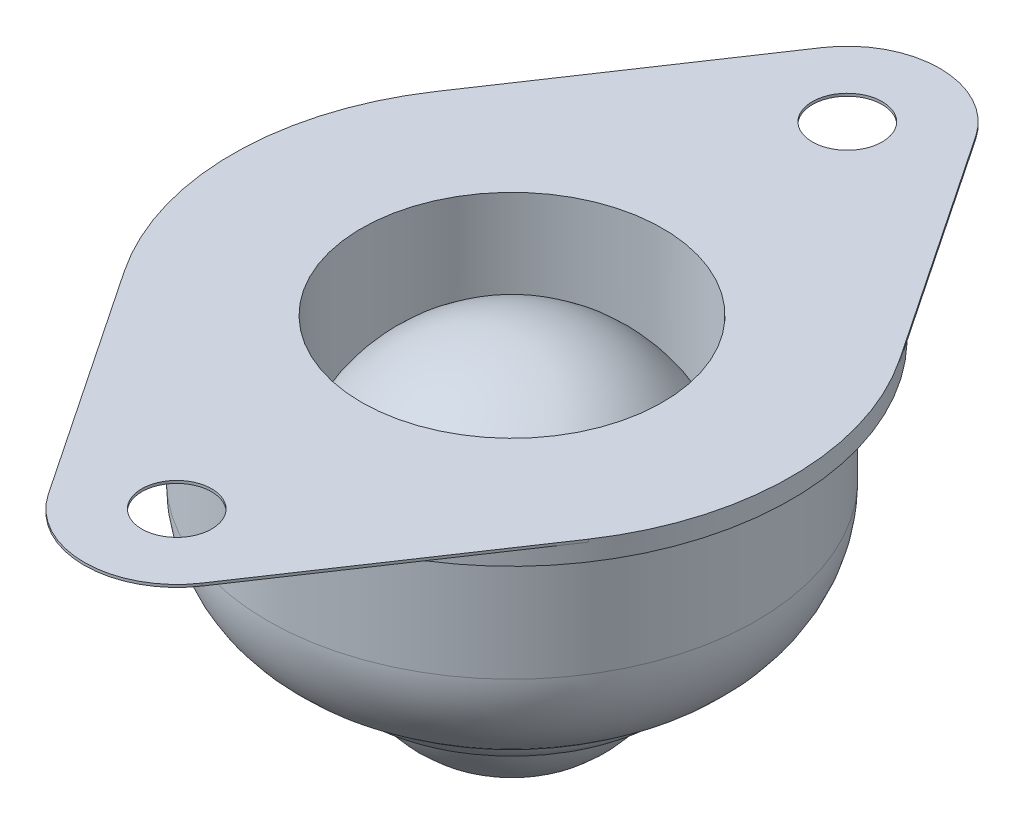
ISO-10303-21;
HEADER;
FILE_DESCRIPTION(('STEP AP214'),'2;1');
FILE_NAME('part.step','',(''),(''),'','','');
FILE_SCHEMA(('AUTOMOTIVE_DESIGN { 1 0 10303 214 1 1 1 1 }'));
ENDSEC;
DATA;
#1=APPLICATION_CONTEXT('core data for automotive mechanical design processes');
#2=APPLICATION_PROTOCOL_DEFINITION('international standard','automotive_design',2000,#1);
#3=PRODUCT_CONTEXT('',#1,'mechanical');
#4=PRODUCT('Part','Part','',(#3));
#5=PRODUCT_RELATED_PRODUCT_CATEGORY('part','',(#4));
#6=PRODUCT_DEFINITION_FORMATION('','',#4);
#7=PRODUCT_DEFINITION_CONTEXT('part definition',#1,'design');
#8=PRODUCT_DEFINITION('design','',#6,#7);
#9=PRODUCT_DEFINITION_SHAPE('','',#8);
#10=(LENGTH_UNIT() NAMED_UNIT(*) SI_UNIT(.MILLI.,.METRE.));
#11=(NAMED_UNIT(*) PLANE_ANGLE_UNIT() SI_UNIT($,.RADIAN.));
#12=(NAMED_UNIT(*) SI_UNIT($,.STERADIAN.) SOLID_ANGLE_UNIT());
#13=UNCERTAINTY_MEASURE_WITH_UNIT(LENGTH_MEASURE(1.E-05),#10,'distance_accuracy_value','');
#14=(GEOMETRIC_REPRESENTATION_CONTEXT(3) GLOBAL_UNCERTAINTY_ASSIGNED_CONTEXT((#13)) GLOBAL_UNIT_ASSIGNED_CONTEXT((#10,
#11,#12)) REPRESENTATION_CONTEXT('',''));
#15=CARTESIAN_POINT('',(0.,0.,0.));
#16=DIRECTION('',(0.,0.,1.));
#17=DIRECTION('',(1.,0.,0.));
#18=AXIS2_PLACEMENT_3D('',#15,#16,#17);
#19=CARTESIAN_POINT('',(0.,7.5,0.));
#20=DIRECTION('',(0.,1.,0.));
#21=DIRECTION('',(1.,0.,0.));
#22=AXIS2_PLACEMENT_3D('',#19,#20,#21);
#23=SPHERICAL_SURFACE('',#22,7.5);
#24=CARTESIAN_POINT('',(0.,5.07300335395181,0.));
#25=DIRECTION('',(0.,1.,0.));
#26=DIRECTION('',(0.,0.,1.));
#27=AXIS2_PLACEMENT_3D('',#24,#25,#26);
#28=CIRCLE('',#27,7.0964559661898);
#29=CARTESIAN_POINT('',(0.,5.07300335395181,7.0964559661898));
#30=VERTEX_POINT('',#29);
#31=EDGE_CURVE('E110',#30,#30,#28,.T.);
#32=ORIENTED_EDGE('',*,*,#31,.F.);
#33=EDGE_LOOP('',(#32));
#34=FACE_BOUND('',#33,.T.);
#35=ADVANCED_FACE('F34',(#34),#23,.T.);
#36=CARTESIAN_POINT('',(0.,20.2219191915097,0.));
#37=DIRECTION('',(0.,1.,0.));
#38=DIRECTION('',(0.,0.,1.));
#39=AXIS2_PLACEMENT_3D('',#36,#37,#38);
#40=CYLINDRICAL_SURFACE('',#39,16.);
#41=CARTESIAN_POINT('',(0.,21.11,0.));
#42=DIRECTION('',(0.,1.,0.));
#43=DIRECTION('',(0.,0.,1.));
#44=AXIS2_PLACEMENT_3D('',#41,#42,#43);
#45=CIRCLE('',#44,16.);
#46=CARTESIAN_POINT('',(13.2850688954012,21.11,-8.91666666666665));
#47=VERTEX_POINT('',#46);
#48=CARTESIAN_POINT('',(-13.2850688954012,21.11,-8.91666666666667));
#49=VERTEX_POINT('',#48);
#50=EDGE_CURVE('E41',#47,#49,#45,.T.);
#51=ORIENTED_EDGE('',*,*,#50,.F.);
#52=DIRECTION('',(0.,-1.,0.));
#53=VECTOR('',#52,1.);
#54=CARTESIAN_POINT('',(13.2850688954012,21.26,-8.91666666666666));
#55=LINE('',#54,#53);
#56=CARTESIAN_POINT('',(13.2850688954012,21.26,-8.91666666666666));
#57=VERTEX_POINT('',#56);
#58=EDGE_CURVE('E175',#57,#47,#55,.T.);
#59=ORIENTED_EDGE('',*,*,#58,.F.);
#60=CARTESIAN_POINT('',(0.,21.26,0.));
#61=DIRECTION('',(0.,1.,0.));
#62=DIRECTION('',(0.,0.,1.));
#63=AXIS2_PLACEMENT_3D('',#60,#61,#62);
#64=CIRCLE('',#63,16.);
#65=CARTESIAN_POINT('',(13.2850688954012,21.26,8.91666666666666));
#66=VERTEX_POINT('',#65);
#67=EDGE_CURVE('E118',#66,#57,#64,.T.);
#68=ORIENTED_EDGE('',*,*,#67,.F.);
#69=DIRECTION('',(0.,-1.,0.));
#70=VECTOR('',#69,1.);
#71=CARTESIAN_POINT('',(13.2850688954012,21.26,8.91666666666666));
#72=LINE('',#71,#70);
#73=CARTESIAN_POINT('',(13.2850688954012,21.11,8.91666666666666));
#74=VERTEX_POINT('',#73);
#75=EDGE_CURVE('E111',#66,#74,#72,.T.);
#76=ORIENTED_EDGE('',*,*,#75,.T.);
#77=CARTESIAN_POINT('',(-13.2850688954012,21.11,8.91666666666667));
#78=VERTEX_POINT('',#77);
#79=EDGE_CURVE('E48',#78,#74,#45,.T.);
#80=ORIENTED_EDGE('',*,*,#79,.F.);
#81=DIRECTION('',(0.,-1.,0.));
#82=VECTOR('',#81,1.);
#83=CARTESIAN_POINT('',(-13.2850688954012,21.26,8.91666666666667));
#84=LINE('',#83,#82);
#85=CARTESIAN_POINT('',(-13.2850688954012,21.26,8.91666666666667));
#86=VERTEX_POINT('',#85);
#87=EDGE_CURVE('E165',#86,#78,#84,.T.);
#88=ORIENTED_EDGE('',*,*,#87,.F.);
#89=CARTESIAN_POINT('',(-13.2850688954012,21.26,-8.91666666666667));
#90=VERTEX_POINT('',#89);
#91=EDGE_CURVE('E132',#90,#86,#64,.T.);
#92=ORIENTED_EDGE('',*,*,#91,.F.);
#93=DIRECTION('',(0.,-1.,0.));
#94=VECTOR('',#93,1.);
#95=CARTESIAN_POINT('',(-13.2850688954012,21.26,-8.91666666666667));
#96=LINE('',#95,#94);
#97=EDGE_CURVE('E167',#90,#49,#96,.T.);
#98=ORIENTED_EDGE('',*,*,#97,.T.);
#99=EDGE_LOOP('',(#51,#59,#68,#76,#80,#88,#92,#98));
#100=FACE_BOUND('',#99,.T.);
#101=CARTESIAN_POINT('',(0.,20.1236584445246,0.));
#102=DIRECTION('',(0.,1.,0.));
#103=DIRECTION('',(0.,0.,1.));
#104=AXIS2_PLACEMENT_3D('',#101,#102,#103);
#105=CIRCLE('',#104,16.);
#106=CARTESIAN_POINT('',(0.,20.1236584445246,16.));
#107=VERTEX_POINT('',#106);
#108=EDGE_CURVE('E190',#107,#107,#105,.T.);
#109=ORIENTED_EDGE('',*,*,#108,.T.);
#110=EDGE_LOOP('',(#109));
#111=FACE_BOUND('',#110,.T.);
#112=ADVANCED_FACE('F195',(#100,#111),#40,.T.);
#113=CARTESIAN_POINT('',(0.,18.139051508652,0.));
#114=DIRECTION('',(0.,1.,0.));
#115=DIRECTION('',(0.,0.,1.));
#116=AXIS2_PLACEMENT_3D('',#113,#114,#115);
#117=TOROIDAL_SURFACE('',#116,15.7489809292657,2.00041877210397);
#118=ORIENTED_EDGE('',*,*,#108,.F.);
#119=EDGE_LOOP('',(#118));
#120=FACE_BOUND('',#119,.T.);
#121=CARTESIAN_POINT('',(0.,19.11,0.));
#122=DIRECTION('',(0.,1.,0.));
#123=DIRECTION('',(0.,0.,1.));
#124=AXIS2_PLACEMENT_3D('',#121,#122,#123);
#125=CIRCLE('',#124,14.);
#126=CARTESIAN_POINT('',(0.,19.11,14.));
#127=VERTEX_POINT('',#126);
#128=EDGE_CURVE('E187',#127,#127,#125,.T.);
#129=ORIENTED_EDGE('',*,*,#128,.T.);
#130=EDGE_LOOP('',(#129));
#131=FACE_BOUND('',#130,.T.);
#132=ADVANCED_FACE('F232',(#120,#131),#117,.F.);
#133=CARTESIAN_POINT('',(0.,20.2219191915097,0.));
#134=DIRECTION('',(0.,1.,0.));
#135=DIRECTION('',(0.,0.,1.));
#136=AXIS2_PLACEMENT_3D('',#133,#134,#135);
#137=CYLINDRICAL_SURFACE('',#136,14.);
#138=ORIENTED_EDGE('',*,*,#128,.F.);
#139=EDGE_LOOP('',(#138));
#140=FACE_BOUND('',#139,.T.);
#141=CARTESIAN_POINT('',(0.,13.11,0.));
#142=DIRECTION('',(0.,1.,0.));
#143=DIRECTION('',(0.,0.,1.));
#144=AXIS2_PLACEMENT_3D('',#141,#142,#143);
#145=CIRCLE('',#144,14.);
#146=CARTESIAN_POINT('',(0.,13.11,14.));
#147=VERTEX_POINT('',#146);
#148=EDGE_CURVE('E184',#147,#147,#145,.T.);
#149=ORIENTED_EDGE('',*,*,#148,.T.);
#150=EDGE_LOOP('',(#149));
#151=FACE_BOUND('',#150,.T.);
#152=ADVANCED_FACE('F248',(#140,#151),#137,.T.);
#153=CARTESIAN_POINT('',(0.,13.11,0.));
#154=DIRECTION('',(0.,1.,0.));
#155=DIRECTION('',(0.,0.,1.));
#156=AXIS2_PLACEMENT_3D('',#153,#154,#155);
#157=TOROIDAL_SURFACE('',#156,7.25011691103347,6.74988308896653);
#158=ORIENTED_EDGE('',*,*,#148,.F.);
#159=EDGE_LOOP('',(#158));
#160=FACE_BOUND('',#159,.T.);
#161=CARTESIAN_POINT('',(0.,6.74561764648976,0.));
#162=DIRECTION('',(0.,1.,0.));
#163=DIRECTION('',(0.,0.,1.));
#164=AXIS2_PLACEMENT_3D('',#161,#162,#163);
#165=CIRCLE('',#164,9.49857393153526);
#166=CARTESIAN_POINT('',(0.,6.74561764648976,9.49857393153526));
#167=VERTEX_POINT('',#166);
#168=EDGE_CURVE('E181',#167,#167,#165,.T.);
#169=ORIENTED_EDGE('',*,*,#168,.T.);
#170=EDGE_LOOP('',(#169));
#171=FACE_BOUND('',#170,.T.);
#172=ADVANCED_FACE('F239',(#160,#171),#157,.T.);
#173=CARTESIAN_POINT('',(0.,7.33975394743478,0.));
#174=DIRECTION('',(0.,1.,0.));
#175=DIRECTION('',(0.,0.,1.));
#176=AXIS2_PLACEMENT_3D('',#173,#174,#175);
#177=TOROIDAL_SURFACE('',#176,7.30148553274129,2.27600425663392);
#178=ORIENTED_EDGE('',*,*,#168,.F.);
#179=EDGE_LOOP('',(#178));
#180=FACE_BOUND('',#179,.T.);
#181=ORIENTED_EDGE('',*,*,#31,.T.);
#182=EDGE_LOOP('',(#181));
#183=FACE_BOUND('',#182,.T.);
#184=ADVANCED_FACE('F236',(#180,#183),#177,.T.);
#185=CARTESIAN_POINT('',(0.,21.11,0.));
#186=DIRECTION('',(0.,1.,0.));
#187=DIRECTION('',(0.,0.,1.));
#188=AXIS2_PLACEMENT_3D('',#185,#186,#187);
#189=PLANE('',#188);
#190=CARTESIAN_POINT('',(0.,21.11,-19.2));
#191=DIRECTION('',(0.,1.,0.));
#192=DIRECTION('',(0.,0.,1.));
#193=AXIS2_PLACEMENT_3D('',#190,#191,#192);
#194=CIRCLE('',#193,2.);
#195=CARTESIAN_POINT('',(0.,21.11,-17.2));
#196=VERTEX_POINT('',#195);
#197=EDGE_CURVE('E124',#196,#196,#194,.T.);
#198=ORIENTED_EDGE('',*,*,#197,.T.);
#199=EDGE_LOOP('',(#198));
#200=FACE_BOUND('',#199,.T.);
#201=DIRECTION('',(0.557291666666666,0.,0.830316805962573));
#202=VECTOR('',#201,1.);
#203=CARTESIAN_POINT('',(13.2850688954012,21.11,-8.91666666666665));
#204=LINE('',#203,#202);
#205=CARTESIAN_POINT('',(4.40067907160164,21.11,-22.1536458333333));
#206=VERTEX_POINT('',#205);
#207=EDGE_CURVE('E153',#206,#47,#204,.T.);
#208=ORIENTED_EDGE('',*,*,#207,.T.);
#209=ORIENTED_EDGE('',*,*,#50,.T.);
#210=DIRECTION('',(-0.557291666666667,0.,0.830316805962573));
#211=VECTOR('',#210,1.);
#212=CARTESIAN_POINT('',(-13.2850688954012,21.11,-8.91666666666667));
#213=LINE('',#212,#211);
#214=CARTESIAN_POINT('',(-4.40067907160164,21.11,-22.1536458333333));
#215=VERTEX_POINT('',#214);
#216=EDGE_CURVE('E157',#215,#49,#213,.T.);
#217=ORIENTED_EDGE('',*,*,#216,.F.);
#218=CARTESIAN_POINT('',(0.,21.11,-19.2));
#219=DIRECTION('',(0.,1.,0.));
#220=DIRECTION('',(0.,0.,1.));
#221=AXIS2_PLACEMENT_3D('',#218,#219,#220);
#222=CIRCLE('',#221,5.3);
#223=EDGE_CURVE('E155',#206,#215,#222,.T.);
#224=ORIENTED_EDGE('',*,*,#223,.F.);
#225=EDGE_LOOP('',(#208,#209,#217,#224));
#226=FACE_BOUND('',#225,.T.);
#227=ADVANCED_FACE('F238',(#200,#226),#189,.F.);
#228=CARTESIAN_POINT('',(0.,21.11,19.2));
#229=DIRECTION('',(0.,1.,0.));
#230=DIRECTION('',(0.,0.,1.));
#231=AXIS2_PLACEMENT_3D('',#228,#229,#230);
#232=CIRCLE('',#231,2.);
#233=CARTESIAN_POINT('',(0.,21.11,21.2));
#234=VERTEX_POINT('',#233);
#235=EDGE_CURVE('E127',#234,#234,#232,.F.);
#236=ORIENTED_EDGE('',*,*,#235,.F.);
#237=EDGE_LOOP('',(#236));
#238=FACE_BOUND('',#237,.T.);
#239=DIRECTION('',(-0.557291666666667,0.,-0.830316805962573));
#240=VECTOR('',#239,1.);
#241=CARTESIAN_POINT('',(-13.2850688954012,21.11,8.91666666666666));
#242=LINE('',#241,#240);
#243=CARTESIAN_POINT('',(-4.40067907160164,21.11,22.1536458333333));
#244=VERTEX_POINT('',#243);
#245=EDGE_CURVE('E159',#244,#78,#242,.T.);
#246=ORIENTED_EDGE('',*,*,#245,.T.);
#247=ORIENTED_EDGE('',*,*,#79,.T.);
#248=DIRECTION('',(0.557291666666666,0.,-0.830316805962573));
#249=VECTOR('',#248,1.);
#250=CARTESIAN_POINT('',(13.2850688954012,21.11,8.91666666666665));
#251=LINE('',#250,#249);
#252=CARTESIAN_POINT('',(4.40067907160164,21.11,22.1536458333333));
#253=VERTEX_POINT('',#252);
#254=EDGE_CURVE('E151',#253,#74,#251,.T.);
#255=ORIENTED_EDGE('',*,*,#254,.F.);
#256=CARTESIAN_POINT('',(0.,21.11,19.2));
#257=DIRECTION('',(0.,1.,0.));
#258=DIRECTION('',(0.,0.,1.));
#259=AXIS2_PLACEMENT_3D('',#256,#257,#258);
#260=CIRCLE('',#259,5.3);
#261=EDGE_CURVE('E106',#253,#244,#260,.F.);
#262=ORIENTED_EDGE('',*,*,#261,.T.);
#263=EDGE_LOOP('',(#246,#247,#255,#262));
#264=FACE_BOUND('',#263,.T.);
#265=ADVANCED_FACE('F193',(#238,#264),#189,.F.);
#266=CARTESIAN_POINT('',(0.,21.26,19.2));
#267=DIRECTION('',(0.,-1.,0.));
#268=DIRECTION('',(0.,0.,-1.));
#269=AXIS2_PLACEMENT_3D('',#266,#267,#268);
#270=CYLINDRICAL_SURFACE('',#269,5.3);
#271=ORIENTED_EDGE('',*,*,#261,.F.);
#272=DIRECTION('',(0.,-1.,0.));
#273=VECTOR('',#272,1.);
#274=CARTESIAN_POINT('',(4.40067907160164,21.26,22.1536458333333));
#275=LINE('',#274,#273);
#276=CARTESIAN_POINT('',(4.40067907160164,21.26,22.1536458333333));
#277=VERTEX_POINT('',#276);
#278=EDGE_CURVE('E99',#277,#253,#275,.T.);
#279=ORIENTED_EDGE('',*,*,#278,.F.);
#280=CARTESIAN_POINT('',(0.,21.26,19.2));
#281=DIRECTION('',(0.,1.,0.));
#282=DIRECTION('',(0.,0.,1.));
#283=AXIS2_PLACEMENT_3D('',#280,#281,#282);
#284=CIRCLE('',#283,5.3);
#285=CARTESIAN_POINT('',(-4.40067907160164,21.26,22.1536458333333));
#286=VERTEX_POINT('',#285);
#287=EDGE_CURVE('E103',#277,#286,#284,.F.);
#288=ORIENTED_EDGE('',*,*,#287,.T.);
#289=DIRECTION('',(0.,-1.,0.));
#290=VECTOR('',#289,1.);
#291=CARTESIAN_POINT('',(-4.40067907160164,21.26,22.1536458333333));
#292=LINE('',#291,#290);
#293=EDGE_CURVE('E149',#286,#244,#292,.T.);
#294=ORIENTED_EDGE('',*,*,#293,.T.);
#295=EDGE_LOOP('',(#271,#279,#288,#294));
#296=FACE_BOUND('',#295,.T.);
#297=ADVANCED_FACE('F101',(#296),#270,.T.);
#298=CARTESIAN_POINT('',(13.2850688954012,21.26,8.91666666666665));
#299=DIRECTION('',(-0.830316805962573,0.,-0.557291666666666));
#300=DIRECTION('',(-0.557291666666666,0.,0.830316805962573));
#301=AXIS2_PLACEMENT_3D('',#298,#299,#300);
#302=PLANE('',#301);
#303=ORIENTED_EDGE('',*,*,#254,.T.);
#304=ORIENTED_EDGE('',*,*,#75,.F.);
#305=DIRECTION('',(0.557291666666666,0.,-0.830316805962573));
#306=VECTOR('',#305,1.);
#307=CARTESIAN_POINT('',(13.2850688954012,21.26,8.91666666666665));
#308=LINE('',#307,#306);
#309=EDGE_CURVE('E114',#277,#66,#308,.T.);
#310=ORIENTED_EDGE('',*,*,#309,.F.);
#311=ORIENTED_EDGE('',*,*,#278,.T.);
#312=EDGE_LOOP('',(#303,#304,#310,#311));
#313=FACE_BOUND('',#312,.T.);
#314=ADVANCED_FACE('F115',(#313),#302,.F.);
#315=CARTESIAN_POINT('',(13.2850688954012,21.26,-8.91666666666665));
#316=DIRECTION('',(0.830316805962573,0.,-0.557291666666666));
#317=DIRECTION('',(-0.557291666666666,0.,-0.830316805962573));
#318=AXIS2_PLACEMENT_3D('',#315,#316,#317);
#319=PLANE('',#318);
#320=ORIENTED_EDGE('',*,*,#207,.F.);
#321=DIRECTION('',(0.,-1.,0.));
#322=VECTOR('',#321,1.);
#323=CARTESIAN_POINT('',(4.40067907160164,21.26,-22.1536458333333));
#324=LINE('',#323,#322);
#325=CARTESIAN_POINT('',(4.40067907160164,21.26,-22.1536458333333));
#326=VERTEX_POINT('',#325);
#327=EDGE_CURVE('E173',#326,#206,#324,.T.);
#328=ORIENTED_EDGE('',*,*,#327,.F.);
#329=DIRECTION('',(0.557291666666666,0.,0.830316805962573));
#330=VECTOR('',#329,1.);
#331=CARTESIAN_POINT('',(13.2850688954012,21.26,-8.91666666666665));
#332=LINE('',#331,#330);
#333=EDGE_CURVE('E131',#326,#57,#332,.T.);
#334=ORIENTED_EDGE('',*,*,#333,.T.);
#335=ORIENTED_EDGE('',*,*,#58,.T.);
#336=EDGE_LOOP('',(#320,#328,#334,#335));
#337=FACE_BOUND('',#336,.T.);
#338=ADVANCED_FACE('F203',(#337),#319,.T.);
#339=CARTESIAN_POINT('',(0.,21.26,-19.2));
#340=DIRECTION('',(0.,-1.,0.));
#341=DIRECTION('',(0.,0.,-1.));
#342=AXIS2_PLACEMENT_3D('',#339,#340,#341);
#343=CYLINDRICAL_SURFACE('',#342,5.3);
#344=ORIENTED_EDGE('',*,*,#223,.T.);
#345=DIRECTION('',(0.,-1.,0.));
#346=VECTOR('',#345,1.);
#347=CARTESIAN_POINT('',(-4.40067907160164,21.26,-22.1536458333333));
#348=LINE('',#347,#346);
#349=CARTESIAN_POINT('',(-4.40067907160164,21.26,-22.1536458333333));
#350=VERTEX_POINT('',#349);
#351=EDGE_CURVE('E170',#350,#215,#348,.T.);
#352=ORIENTED_EDGE('',*,*,#351,.F.);
#353=CARTESIAN_POINT('',(0.,21.26,-19.2));
#354=DIRECTION('',(0.,1.,0.));
#355=DIRECTION('',(0.,0.,1.));
#356=AXIS2_PLACEMENT_3D('',#353,#354,#355);
#357=CIRCLE('',#356,5.3);
#358=EDGE_CURVE('E135',#326,#350,#357,.T.);
#359=ORIENTED_EDGE('',*,*,#358,.F.);
#360=ORIENTED_EDGE('',*,*,#327,.T.);
#361=EDGE_LOOP('',(#344,#352,#359,#360));
#362=FACE_BOUND('',#361,.T.);
#363=ADVANCED_FACE('F206',(#362),#343,.T.);
#364=CARTESIAN_POINT('',(-13.2850688954012,21.26,-8.91666666666667));
#365=DIRECTION('',(0.830316805962573,0.,0.557291666666667));
#366=DIRECTION('',(0.557291666666667,0.,-0.830316805962573));
#367=AXIS2_PLACEMENT_3D('',#364,#365,#366);
#368=PLANE('',#367);
#369=ORIENTED_EDGE('',*,*,#216,.T.);
#370=ORIENTED_EDGE('',*,*,#97,.F.);
#371=DIRECTION('',(-0.557291666666667,0.,0.830316805962573));
#372=VECTOR('',#371,1.);
#373=CARTESIAN_POINT('',(-13.2850688954012,21.26,-8.91666666666667));
#374=LINE('',#373,#372);
#375=EDGE_CURVE('E137',#350,#90,#374,.T.);
#376=ORIENTED_EDGE('',*,*,#375,.F.);
#377=ORIENTED_EDGE('',*,*,#351,.T.);
#378=EDGE_LOOP('',(#369,#370,#376,#377));
#379=FACE_BOUND('',#378,.T.);
#380=ADVANCED_FACE('F210',(#379),#368,.F.);
#381=CARTESIAN_POINT('',(0.,21.26,19.2));
#382=DIRECTION('',(0.,-1.,0.));
#383=DIRECTION('',(0.,0.,-1.));
#384=AXIS2_PLACEMENT_3D('',#381,#382,#383);
#385=CYLINDRICAL_SURFACE('',#384,2.);
#386=CARTESIAN_POINT('',(0.,21.26,19.2));
#387=DIRECTION('',(0.,1.,0.));
#388=DIRECTION('',(0.,0.,1.));
#389=AXIS2_PLACEMENT_3D('',#386,#387,#388);
#390=CIRCLE('',#389,2.);
#391=CARTESIAN_POINT('',(0.,21.26,21.2));
#392=VERTEX_POINT('',#391);
#393=EDGE_CURVE('E140',#392,#392,#390,.F.);
#394=ORIENTED_EDGE('',*,*,#393,.F.);
#395=EDGE_LOOP('',(#394));
#396=FACE_BOUND('',#395,.T.);
#397=ORIENTED_EDGE('',*,*,#235,.T.);
#398=EDGE_LOOP('',(#397));
#399=FACE_BOUND('',#398,.T.);
#400=ADVANCED_FACE('F216',(#396,#399),#385,.F.);
#401=CARTESIAN_POINT('',(-13.2850688954012,21.26,8.91666666666666));
#402=DIRECTION('',(-0.830316805962573,0.,0.557291666666667));
#403=DIRECTION('',(0.557291666666667,0.,0.830316805962573));
#404=AXIS2_PLACEMENT_3D('',#401,#402,#403);
#405=PLANE('',#404);
#406=ORIENTED_EDGE('',*,*,#245,.F.);
#407=ORIENTED_EDGE('',*,*,#293,.F.);
#408=DIRECTION('',(-0.557291666666667,0.,-0.830316805962573));
#409=VECTOR('',#408,1.);
#410=CARTESIAN_POINT('',(-13.2850688954012,21.26,8.91666666666666));
#411=LINE('',#410,#409);
#412=EDGE_CURVE('E123',#286,#86,#411,.T.);
#413=ORIENTED_EDGE('',*,*,#412,.T.);
#414=ORIENTED_EDGE('',*,*,#87,.T.);
#415=EDGE_LOOP('',(#406,#407,#413,#414));
#416=FACE_BOUND('',#415,.T.);
#417=ADVANCED_FACE('F213',(#416),#405,.T.);
#418=CARTESIAN_POINT('',(0.,21.26,-19.2));
#419=DIRECTION('',(0.,-1.,0.));
#420=DIRECTION('',(0.,0.,-1.));
#421=AXIS2_PLACEMENT_3D('',#418,#419,#420);
#422=CYLINDRICAL_SURFACE('',#421,2.);
#423=CARTESIAN_POINT('',(0.,21.26,-19.2));
#424=DIRECTION('',(0.,1.,0.));
#425=DIRECTION('',(0.,0.,1.));
#426=AXIS2_PLACEMENT_3D('',#423,#424,#425);
#427=CIRCLE('',#426,2.);
#428=CARTESIAN_POINT('',(0.,21.26,-17.2));
#429=VERTEX_POINT('',#428);
#430=EDGE_CURVE('E146',#429,#429,#427,.T.);
#431=ORIENTED_EDGE('',*,*,#430,.T.);
#432=EDGE_LOOP('',(#431));
#433=FACE_BOUND('',#432,.T.);
#434=ORIENTED_EDGE('',*,*,#197,.F.);
#435=EDGE_LOOP('',(#434));
#436=FACE_BOUND('',#435,.T.);
#437=ADVANCED_FACE('F215',(#433,#436),#422,.F.);
#438=CARTESIAN_POINT('',(0.,21.26,0.));
#439=DIRECTION('',(0.,1.,0.));
#440=DIRECTION('',(0.,0.,1.));
#441=AXIS2_PLACEMENT_3D('',#438,#439,#440);
#442=PLANE('',#441);
#443=ORIENTED_EDGE('',*,*,#287,.F.);
#444=ORIENTED_EDGE('',*,*,#309,.T.);
#445=ORIENTED_EDGE('',*,*,#67,.T.);
#446=ORIENTED_EDGE('',*,*,#333,.F.);
#447=ORIENTED_EDGE('',*,*,#358,.T.);
#448=ORIENTED_EDGE('',*,*,#375,.T.);
#449=ORIENTED_EDGE('',*,*,#91,.T.);
#450=ORIENTED_EDGE('',*,*,#412,.F.);
#451=EDGE_LOOP('',(#443,#444,#445,#446,#447,#448,#449,#450));
#452=FACE_BOUND('',#451,.T.);
#453=ORIENTED_EDGE('',*,*,#393,.T.);
#454=EDGE_LOOP('',(#453));
#455=FACE_BOUND('',#454,.T.);
#456=CARTESIAN_POINT('',(0.,21.26,0.));
#457=DIRECTION('',(0.,1.,0.));
#458=DIRECTION('',(0.,0.,1.));
#459=AXIS2_PLACEMENT_3D('',#456,#457,#458);
#460=CIRCLE('',#459,8.6262833657979);
#461=CARTESIAN_POINT('',(0.,21.26,8.6262833657979));
#462=VERTEX_POINT('',#461);
#463=EDGE_CURVE('E143',#462,#462,#460,.F.);
#464=ORIENTED_EDGE('',*,*,#463,.T.);
#465=EDGE_LOOP('',(#464));
#466=FACE_BOUND('',#465,.T.);
#467=ORIENTED_EDGE('',*,*,#430,.F.);
#468=EDGE_LOOP('',(#467));
#469=FACE_BOUND('',#468,.T.);
#470=ADVANCED_FACE('F120',(#452,#455,#466,#469),#442,.T.);
#471=CARTESIAN_POINT('',(0.,10.9753452595014,0.));
#472=DIRECTION('',(0.,1.,0.));
#473=DIRECTION('',(1.,0.,0.));
#474=AXIS2_PLACEMENT_3D('',#471,#472,#473);
#475=SPHERICAL_SURFACE('',#474,9.24657393200827);
#476=CARTESIAN_POINT('',(0.,14.3049645730346,0.));
#477=DIRECTION('',(0.,1.,0.));
#478=DIRECTION('',(0.,0.,1.));
#479=AXIS2_PLACEMENT_3D('',#476,#477,#478);
#480=CIRCLE('',#479,8.6262833657979);
#481=CARTESIAN_POINT('',(0.,14.3049645730346,8.6262833657979));
#482=VERTEX_POINT('',#481);
#483=EDGE_CURVE('E11',#482,#482,#480,.T.);
#484=ORIENTED_EDGE('',*,*,#483,.T.);
#485=EDGE_LOOP('',(#484));
#486=FACE_BOUND('',#485,.T.);
#487=ADVANCED_FACE('F263',(#486),#475,.T.);
#488=CARTESIAN_POINT('',(0.,20.2219191915097,0.));
#489=DIRECTION('',(0.,1.,0.));
#490=DIRECTION('',(0.,0.,1.));
#491=AXIS2_PLACEMENT_3D('',#488,#489,#490);
#492=CYLINDRICAL_SURFACE('',#491,8.6262833657979);
#493=ORIENTED_EDGE('',*,*,#483,.F.);
#494=EDGE_LOOP('',(#493));
#495=FACE_BOUND('',#494,.T.);
#496=ORIENTED_EDGE('',*,*,#463,.F.);
#497=EDGE_LOOP('',(#496));
#498=FACE_BOUND('',#497,.T.);
#499=ADVANCED_FACE('F261',(#495,#498),#492,.F.);
#500=CLOSED_SHELL('',(#35,#112,#132,#152,#172,#184,#227,#265,#297,#314,#338,#363,#380,#400,#417,
#437,#470,#487,#499));
#501=MANIFOLD_SOLID_BREP('B2',#500);
#502=ADVANCED_BREP_SHAPE_REPRESENTATION('',(#18,#501),#14);
#503=SHAPE_DEFINITION_REPRESENTATION(#9,#502);
ENDSEC;
END-ISO-10303-21;
